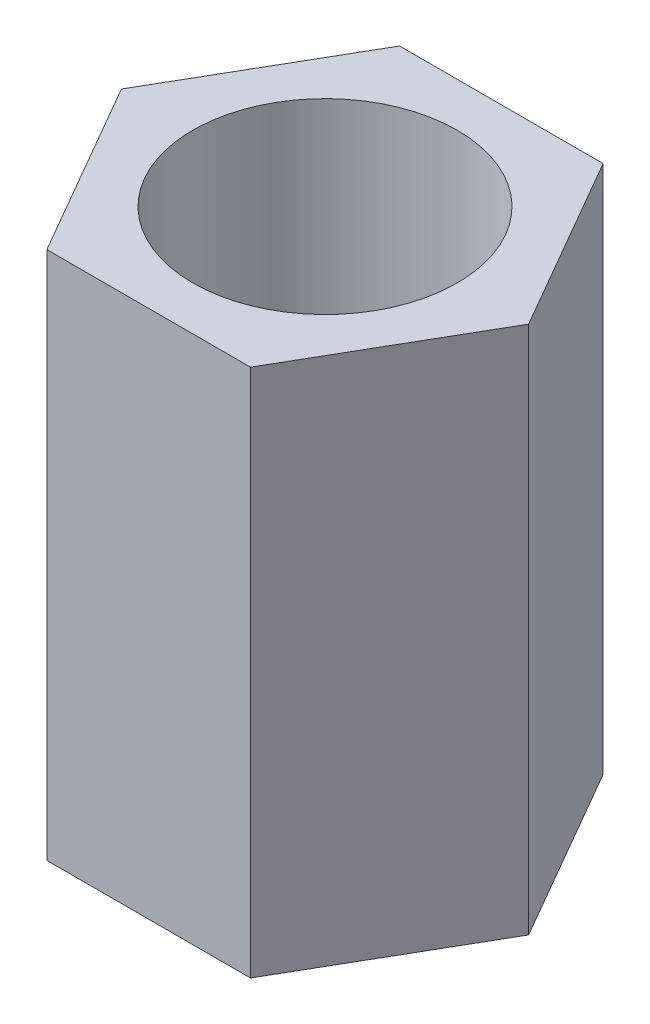
ISO-10303-21;
HEADER;
FILE_DESCRIPTION(('STEP AP214'),'2;1');
FILE_NAME('part.step','',(''),(''),'','','');
FILE_SCHEMA(('AUTOMOTIVE_DESIGN { 1 0 10303 214 1 1 1 1 }'));
ENDSEC;
DATA;
#1=APPLICATION_CONTEXT('core data for automotive mechanical design processes');
#2=APPLICATION_PROTOCOL_DEFINITION('international standard','automotive_design',2000,#1);
#3=PRODUCT_CONTEXT('',#1,'mechanical');
#4=PRODUCT('Part','Part','',(#3));
#5=PRODUCT_RELATED_PRODUCT_CATEGORY('part','',(#4));
#6=PRODUCT_DEFINITION_FORMATION('','',#4);
#7=PRODUCT_DEFINITION_CONTEXT('part definition',#1,'design');
#8=PRODUCT_DEFINITION('design','',#6,#7);
#9=PRODUCT_DEFINITION_SHAPE('','',#8);
#10=(LENGTH_UNIT() NAMED_UNIT(*) SI_UNIT(.MILLI.,.METRE.));
#11=(NAMED_UNIT(*) PLANE_ANGLE_UNIT() SI_UNIT($,.RADIAN.));
#12=(NAMED_UNIT(*) SI_UNIT($,.STERADIAN.) SOLID_ANGLE_UNIT());
#13=UNCERTAINTY_MEASURE_WITH_UNIT(LENGTH_MEASURE(1.E-05),#10,'distance_accuracy_value','');
#14=(GEOMETRIC_REPRESENTATION_CONTEXT(3) GLOBAL_UNCERTAINTY_ASSIGNED_CONTEXT((#13)) GLOBAL_UNIT_ASSIGNED_CONTEXT((#10,
#11,#12)) REPRESENTATION_CONTEXT('',''));
#15=CARTESIAN_POINT('',(0.,0.,0.));
#16=DIRECTION('',(0.,0.,1.));
#17=DIRECTION('',(1.,0.,0.));
#18=AXIS2_PLACEMENT_3D('',#15,#16,#17);
#19=CARTESIAN_POINT('',(0.,2.66666666666667,0.));
#20=DIRECTION('',(0.,1.,0.));
#21=DIRECTION('',(0.,0.,1.));
#22=AXIS2_PLACEMENT_3D('',#19,#20,#21);
#23=PLANE('',#22);
#24=DIRECTION('',(-0.5,0.,-0.866025403784438));
#25=VECTOR('',#24,1.);
#26=CARTESIAN_POINT('',(2.05280095711867,2.66666666666667,0.));
#27=LINE('',#26,#25);
#28=CARTESIAN_POINT('',(2.05280095711867,2.66666666666667,0.));
#29=VERTEX_POINT('',#28);
#30=CARTESIAN_POINT('',(1.02640047855933,2.66666666666667,-1.77777777777778));
#31=VERTEX_POINT('',#30);
#32=EDGE_CURVE('E145',#29,#31,#27,.T.);
#33=ORIENTED_EDGE('',*,*,#32,.T.);
#34=DIRECTION('',(-1.,0.,0.));
#35=VECTOR('',#34,1.);
#36=CARTESIAN_POINT('',(1.02640047855933,2.66666666666667,-1.77777777777778));
#37=LINE('',#36,#35);
#38=CARTESIAN_POINT('',(-1.02640047855934,2.66666666666667,-1.77777777777778));
#39=VERTEX_POINT('',#38);
#40=EDGE_CURVE('E93',#31,#39,#37,.T.);
#41=ORIENTED_EDGE('',*,*,#40,.T.);
#42=DIRECTION('',(-0.5,0.,0.866025403784439));
#43=VECTOR('',#42,1.);
#44=CARTESIAN_POINT('',(-1.02640047855934,2.66666666666667,-1.77777777777778));
#45=LINE('',#44,#43);
#46=CARTESIAN_POINT('',(-2.05280095711867,2.66666666666667,0.));
#47=VERTEX_POINT('',#46);
#48=EDGE_CURVE('E106',#39,#47,#45,.T.);
#49=ORIENTED_EDGE('',*,*,#48,.T.);
#50=DIRECTION('',(0.5,0.,0.866025403784438));
#51=VECTOR('',#50,1.);
#52=CARTESIAN_POINT('',(-2.05280095711867,2.66666666666667,0.));
#53=LINE('',#52,#51);
#54=CARTESIAN_POINT('',(-1.02640047855933,2.66666666666667,1.77777777777778));
#55=VERTEX_POINT('',#54);
#56=EDGE_CURVE('E100',#47,#55,#53,.T.);
#57=ORIENTED_EDGE('',*,*,#56,.T.);
#58=DIRECTION('',(1.,0.,0.));
#59=VECTOR('',#58,1.);
#60=CARTESIAN_POINT('',(-1.02640047855933,2.66666666666667,1.77777777777778));
#61=LINE('',#60,#59);
#62=CARTESIAN_POINT('',(1.02640047855934,2.66666666666667,1.77777777777778));
#63=VERTEX_POINT('',#62);
#64=EDGE_CURVE('E104',#55,#63,#61,.T.);
#65=ORIENTED_EDGE('',*,*,#64,.T.);
#66=DIRECTION('',(0.5,0.,-0.866025403784439));
#67=VECTOR('',#66,1.);
#68=CARTESIAN_POINT('',(1.02640047855934,2.66666666666667,1.77777777777778));
#69=LINE('',#68,#67);
#70=EDGE_CURVE('E56',#63,#29,#69,.T.);
#71=ORIENTED_EDGE('',*,*,#70,.T.);
#72=EDGE_LOOP('',(#33,#41,#49,#57,#65,#71));
#73=FACE_BOUND('',#72,.T.);
#74=CARTESIAN_POINT('',(0.,2.66666666666667,0.));
#75=DIRECTION('',(0.,1.,0.));
#76=DIRECTION('',(0.,0.,1.));
#77=AXIS2_PLACEMENT_3D('',#74,#75,#76);
#78=CIRCLE('',#77,1.33333333333333);
#79=CARTESIAN_POINT('',(0.,2.66666666666667,1.33333333333333));
#80=VERTEX_POINT('',#79);
#81=EDGE_CURVE('E133',#80,#80,#78,.T.);
#82=ORIENTED_EDGE('',*,*,#81,.F.);
#83=EDGE_LOOP('',(#82));
#84=FACE_BOUND('',#83,.T.);
#85=ADVANCED_FACE('F38',(#73,#84),#23,.T.);
#86=CARTESIAN_POINT('',(0.,-2.66666666666667,0.));
#87=DIRECTION('',(0.,1.,0.));
#88=DIRECTION('',(0.,0.,1.));
#89=AXIS2_PLACEMENT_3D('',#86,#87,#88);
#90=PLANE('',#89);
#91=DIRECTION('',(-0.5,0.,-0.866025403784438));
#92=VECTOR('',#91,1.);
#93=CARTESIAN_POINT('',(2.05280095711867,-2.66666666666667,0.));
#94=LINE('',#93,#92);
#95=CARTESIAN_POINT('',(2.05280095711867,-2.66666666666667,0.));
#96=VERTEX_POINT('',#95);
#97=CARTESIAN_POINT('',(1.02640047855933,-2.66666666666667,-1.77777777777778));
#98=VERTEX_POINT('',#97);
#99=EDGE_CURVE('E128',#96,#98,#94,.T.);
#100=ORIENTED_EDGE('',*,*,#99,.F.);
#101=DIRECTION('',(0.5,0.,-0.866025403784439));
#102=VECTOR('',#101,1.);
#103=CARTESIAN_POINT('',(1.02640047855934,-2.66666666666667,1.77777777777778));
#104=LINE('',#103,#102);
#105=CARTESIAN_POINT('',(1.02640047855934,-2.66666666666667,1.77777777777778));
#106=VERTEX_POINT('',#105);
#107=EDGE_CURVE('E85',#106,#96,#104,.T.);
#108=ORIENTED_EDGE('',*,*,#107,.F.);
#109=DIRECTION('',(1.,0.,0.));
#110=VECTOR('',#109,1.);
#111=CARTESIAN_POINT('',(-1.02640047855933,-2.66666666666667,1.77777777777778));
#112=LINE('',#111,#110);
#113=CARTESIAN_POINT('',(-1.02640047855933,-2.66666666666667,1.77777777777778));
#114=VERTEX_POINT('',#113);
#115=EDGE_CURVE('E79',#114,#106,#112,.T.);
#116=ORIENTED_EDGE('',*,*,#115,.F.);
#117=DIRECTION('',(0.5,0.,0.866025403784438));
#118=VECTOR('',#117,1.);
#119=CARTESIAN_POINT('',(-2.05280095711867,-2.66666666666667,0.));
#120=LINE('',#119,#118);
#121=CARTESIAN_POINT('',(-2.05280095711867,-2.66666666666667,0.));
#122=VERTEX_POINT('',#121);
#123=EDGE_CURVE('E115',#122,#114,#120,.T.);
#124=ORIENTED_EDGE('',*,*,#123,.F.);
#125=DIRECTION('',(-0.5,0.,0.866025403784439));
#126=VECTOR('',#125,1.);
#127=CARTESIAN_POINT('',(-1.02640047855934,-2.66666666666667,-1.77777777777778));
#128=LINE('',#127,#126);
#129=CARTESIAN_POINT('',(-1.02640047855934,-2.66666666666667,-1.77777777777778));
#130=VERTEX_POINT('',#129);
#131=EDGE_CURVE('E136',#130,#122,#128,.T.);
#132=ORIENTED_EDGE('',*,*,#131,.F.);
#133=DIRECTION('',(-1.,0.,0.));
#134=VECTOR('',#133,1.);
#135=CARTESIAN_POINT('',(1.02640047855933,-2.66666666666667,-1.77777777777778));
#136=LINE('',#135,#134);
#137=EDGE_CURVE('E132',#98,#130,#136,.T.);
#138=ORIENTED_EDGE('',*,*,#137,.F.);
#139=EDGE_LOOP('',(#100,#108,#116,#124,#132,#138));
#140=FACE_BOUND('',#139,.T.);
#141=CARTESIAN_POINT('',(0.,-2.66666666666667,0.));
#142=DIRECTION('',(0.,1.,0.));
#143=DIRECTION('',(0.,0.,1.));
#144=AXIS2_PLACEMENT_3D('',#141,#142,#143);
#145=CIRCLE('',#144,1.33333333333333);
#146=CARTESIAN_POINT('',(0.,-2.66666666666667,1.33333333333333));
#147=VERTEX_POINT('',#146);
#148=EDGE_CURVE('E242',#147,#147,#145,.T.);
#149=ORIENTED_EDGE('',*,*,#148,.T.);
#150=EDGE_LOOP('',(#149));
#151=FACE_BOUND('',#150,.T.);
#152=ADVANCED_FACE('F158',(#140,#151),#90,.F.);
#153=CARTESIAN_POINT('',(2.05280095711867,2.66666666666667,0.));
#154=DIRECTION('',(-0.866025403784439,0.,0.5));
#155=DIRECTION('',(0.5,0.,0.866025403784439));
#156=AXIS2_PLACEMENT_3D('',#153,#154,#155);
#157=PLANE('',#156);
#158=ORIENTED_EDGE('',*,*,#99,.T.);
#159=DIRECTION('',(0.,-1.,0.));
#160=VECTOR('',#159,1.);
#161=CARTESIAN_POINT('',(1.02640047855933,2.66666666666667,-1.77777777777778));
#162=LINE('',#161,#160);
#163=EDGE_CURVE('E11',#31,#98,#162,.T.);
#164=ORIENTED_EDGE('',*,*,#163,.F.);
#165=ORIENTED_EDGE('',*,*,#32,.F.);
#166=DIRECTION('',(0.,-1.,0.));
#167=VECTOR('',#166,1.);
#168=CARTESIAN_POINT('',(2.05280095711867,2.66666666666667,0.));
#169=LINE('',#168,#167);
#170=EDGE_CURVE('E124',#29,#96,#169,.T.);
#171=ORIENTED_EDGE('',*,*,#170,.T.);
#172=EDGE_LOOP('',(#158,#164,#165,#171));
#173=FACE_BOUND('',#172,.T.);
#174=ADVANCED_FACE('F40',(#173),#157,.F.);
#175=CARTESIAN_POINT('',(1.02640047855933,2.66666666666667,-1.77777777777778));
#176=DIRECTION('',(0.,0.,1.));
#177=DIRECTION('',(1.,0.,0.));
#178=AXIS2_PLACEMENT_3D('',#175,#176,#177);
#179=PLANE('',#178);
#180=ORIENTED_EDGE('',*,*,#137,.T.);
#181=DIRECTION('',(0.,-1.,0.));
#182=VECTOR('',#181,1.);
#183=CARTESIAN_POINT('',(-1.02640047855934,2.66666666666667,-1.77777777777778));
#184=LINE('',#183,#182);
#185=EDGE_CURVE('E48',#39,#130,#184,.T.);
#186=ORIENTED_EDGE('',*,*,#185,.F.);
#187=ORIENTED_EDGE('',*,*,#40,.F.);
#188=ORIENTED_EDGE('',*,*,#163,.T.);
#189=EDGE_LOOP('',(#180,#186,#187,#188));
#190=FACE_BOUND('',#189,.T.);
#191=ADVANCED_FACE('F183',(#190),#179,.F.);
#192=CARTESIAN_POINT('',(-1.02640047855934,2.66666666666667,-1.77777777777778));
#193=DIRECTION('',(0.866025403784439,0.,0.5));
#194=DIRECTION('',(0.5,0.,-0.866025403784439));
#195=AXIS2_PLACEMENT_3D('',#192,#193,#194);
#196=PLANE('',#195);
#197=ORIENTED_EDGE('',*,*,#131,.T.);
#198=DIRECTION('',(0.,-1.,0.));
#199=VECTOR('',#198,1.);
#200=CARTESIAN_POINT('',(-2.05280095711867,2.66666666666667,0.));
#201=LINE('',#200,#199);
#202=EDGE_CURVE('E117',#47,#122,#201,.T.);
#203=ORIENTED_EDGE('',*,*,#202,.F.);
#204=ORIENTED_EDGE('',*,*,#48,.F.);
#205=ORIENTED_EDGE('',*,*,#185,.T.);
#206=EDGE_LOOP('',(#197,#203,#204,#205));
#207=FACE_BOUND('',#206,.T.);
#208=ADVANCED_FACE('F155',(#207),#196,.F.);
#209=CARTESIAN_POINT('',(-2.05280095711867,2.66666666666667,0.));
#210=DIRECTION('',(0.866025403784438,0.,-0.5));
#211=DIRECTION('',(-0.5,0.,-0.866025403784439));
#212=AXIS2_PLACEMENT_3D('',#209,#210,#211);
#213=PLANE('',#212);
#214=ORIENTED_EDGE('',*,*,#123,.T.);
#215=DIRECTION('',(0.,-1.,0.));
#216=VECTOR('',#215,1.);
#217=CARTESIAN_POINT('',(-1.02640047855933,2.66666666666667,1.77777777777778));
#218=LINE('',#217,#216);
#219=EDGE_CURVE('E112',#55,#114,#218,.T.);
#220=ORIENTED_EDGE('',*,*,#219,.F.);
#221=ORIENTED_EDGE('',*,*,#56,.F.);
#222=ORIENTED_EDGE('',*,*,#202,.T.);
#223=EDGE_LOOP('',(#214,#220,#221,#222));
#224=FACE_BOUND('',#223,.T.);
#225=ADVANCED_FACE('F113',(#224),#213,.F.);
#226=CARTESIAN_POINT('',(-1.02640047855933,2.66666666666667,1.77777777777778));
#227=DIRECTION('',(0.,0.,-1.));
#228=DIRECTION('',(-1.,0.,0.));
#229=AXIS2_PLACEMENT_3D('',#226,#227,#228);
#230=PLANE('',#229);
#231=ORIENTED_EDGE('',*,*,#115,.T.);
#232=DIRECTION('',(0.,-1.,0.));
#233=VECTOR('',#232,1.);
#234=CARTESIAN_POINT('',(1.02640047855934,2.66666666666667,1.77777777777778));
#235=LINE('',#234,#233);
#236=EDGE_CURVE('E118',#63,#106,#235,.T.);
#237=ORIENTED_EDGE('',*,*,#236,.F.);
#238=ORIENTED_EDGE('',*,*,#64,.F.);
#239=ORIENTED_EDGE('',*,*,#219,.T.);
#240=EDGE_LOOP('',(#231,#237,#238,#239));
#241=FACE_BOUND('',#240,.T.);
#242=ADVANCED_FACE('F120',(#241),#230,.F.);
#243=CARTESIAN_POINT('',(1.02640047855934,2.66666666666667,1.77777777777778));
#244=DIRECTION('',(-0.866025403784439,0.,-0.5));
#245=DIRECTION('',(-0.5,0.,0.866025403784439));
#246=AXIS2_PLACEMENT_3D('',#243,#244,#245);
#247=PLANE('',#246);
#248=ORIENTED_EDGE('',*,*,#107,.T.);
#249=ORIENTED_EDGE('',*,*,#170,.F.);
#250=ORIENTED_EDGE('',*,*,#70,.F.);
#251=ORIENTED_EDGE('',*,*,#236,.T.);
#252=EDGE_LOOP('',(#248,#249,#250,#251));
#253=FACE_BOUND('',#252,.T.);
#254=ADVANCED_FACE('F163',(#253),#247,.F.);
#255=CARTESIAN_POINT('',(0.,2.66666666666667,0.));
#256=DIRECTION('',(0.,-1.,0.));
#257=DIRECTION('',(0.,0.,-1.));
#258=AXIS2_PLACEMENT_3D('',#255,#256,#257);
#259=CYLINDRICAL_SURFACE('',#258,1.33333333333333);
#260=ORIENTED_EDGE('',*,*,#81,.T.);
#261=EDGE_LOOP('',(#260));
#262=FACE_BOUND('',#261,.T.);
#263=ORIENTED_EDGE('',*,*,#148,.F.);
#264=EDGE_LOOP('',(#263));
#265=FACE_BOUND('',#264,.T.);
#266=ADVANCED_FACE('F165',(#262,#265),#259,.F.);
#267=CLOSED_SHELL('',(#85,#152,#174,#191,#208,#225,#242,#254,#266));
#268=MANIFOLD_SOLID_BREP('B2',#267);
#269=ADVANCED_BREP_SHAPE_REPRESENTATION('',(#18,#268),#14);
#270=SHAPE_DEFINITION_REPRESENTATION(#9,#269);
ENDSEC;
END-ISO-10303-21;
